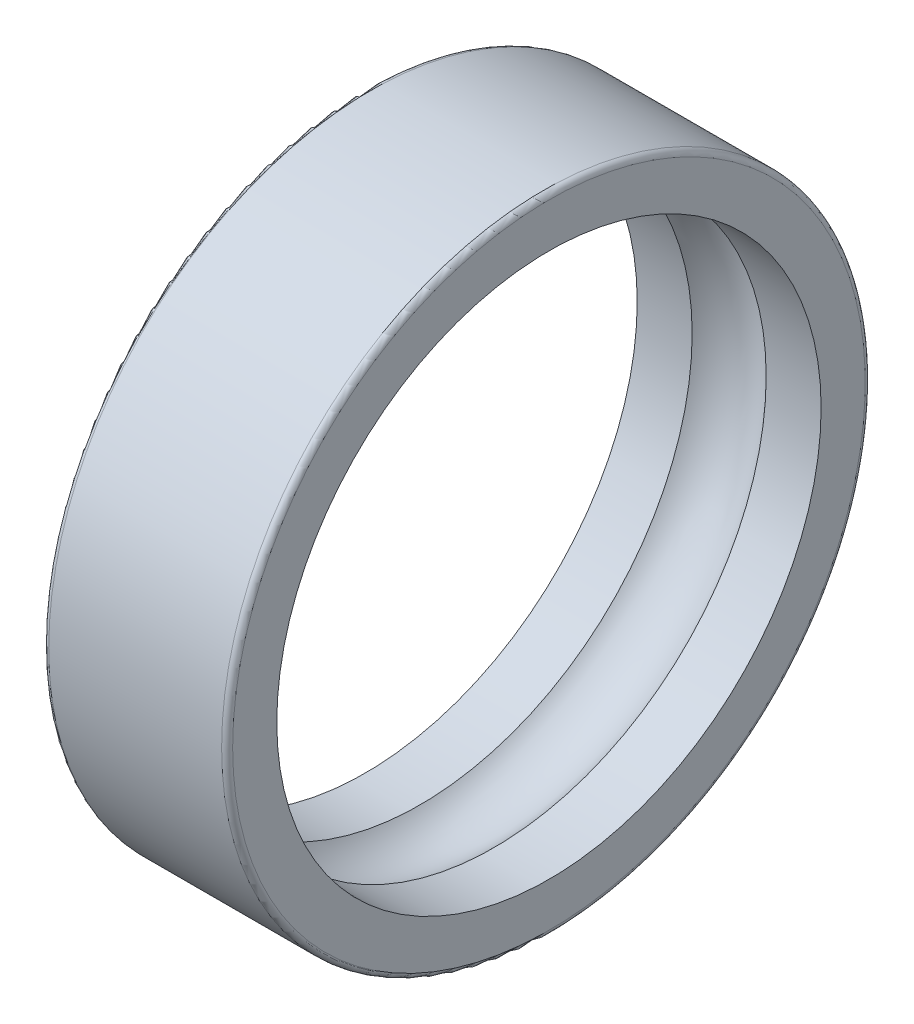
ISO-10303-21;
HEADER;
FILE_DESCRIPTION(('STEP AP214'),'2;1');
FILE_NAME('part.step','',(''),(''),'','','');
FILE_SCHEMA(('AUTOMOTIVE_DESIGN { 1 0 10303 214 1 1 1 1 }'));
ENDSEC;
DATA;
#1=APPLICATION_CONTEXT('core data for automotive mechanical design processes');
#2=APPLICATION_PROTOCOL_DEFINITION('international standard','automotive_design',2000,#1);
#3=PRODUCT_CONTEXT('',#1,'mechanical');
#4=PRODUCT('Part','Part','',(#3));
#5=PRODUCT_RELATED_PRODUCT_CATEGORY('part','',(#4));
#6=PRODUCT_DEFINITION_FORMATION('','',#4);
#7=PRODUCT_DEFINITION_CONTEXT('part definition',#1,'design');
#8=PRODUCT_DEFINITION('design','',#6,#7);
#9=PRODUCT_DEFINITION_SHAPE('','',#8);
#10=(LENGTH_UNIT() NAMED_UNIT(*) SI_UNIT(.MILLI.,.METRE.));
#11=(NAMED_UNIT(*) PLANE_ANGLE_UNIT() SI_UNIT($,.RADIAN.));
#12=(NAMED_UNIT(*) SI_UNIT($,.STERADIAN.) SOLID_ANGLE_UNIT());
#13=UNCERTAINTY_MEASURE_WITH_UNIT(LENGTH_MEASURE(1.E-05),#10,'distance_accuracy_value','');
#14=(GEOMETRIC_REPRESENTATION_CONTEXT(3) GLOBAL_UNCERTAINTY_ASSIGNED_CONTEXT((#13)) GLOBAL_UNIT_ASSIGNED_CONTEXT((#10,
#11,#12)) REPRESENTATION_CONTEXT('',''));
#15=CARTESIAN_POINT('',(0.,0.,0.));
#16=DIRECTION('',(0.,0.,1.));
#17=DIRECTION('',(1.,0.,0.));
#18=AXIS2_PLACEMENT_3D('',#15,#16,#17);
#19=CARTESIAN_POINT('',(0.3,0.,0.));
#20=DIRECTION('',(-1.,0.,0.));
#21=DIRECTION('',(0.,0.,1.));
#22=AXIS2_PLACEMENT_3D('',#19,#20,#21);
#23=TOROIDAL_SURFACE('',#22,17.2,0.300000000000002);
#24=CARTESIAN_POINT('',(0.,0.,0.));
#25=DIRECTION('',(-1.,0.,0.));
#26=DIRECTION('',(0.,0.,1.));
#27=AXIS2_PLACEMENT_3D('',#24,#25,#26);
#28=CIRCLE('',#27,17.2);
#29=CARTESIAN_POINT('',(0.,0.,17.2));
#30=VERTEX_POINT('',#29);
#31=EDGE_CURVE('E10',#30,#30,#28,.T.);
#32=ORIENTED_EDGE('',*,*,#31,.F.);
#33=EDGE_LOOP('',(#32));
#34=FACE_BOUND('',#33,.T.);
#35=CARTESIAN_POINT('',(0.3,0.,0.));
#36=DIRECTION('',(-1.,0.,0.));
#37=DIRECTION('',(0.,0.,1.));
#38=AXIS2_PLACEMENT_3D('',#35,#36,#37);
#39=CIRCLE('',#38,17.5);
#40=CARTESIAN_POINT('',(0.3,0.,17.5));
#41=VERTEX_POINT('',#40);
#42=EDGE_CURVE('E57',#41,#41,#39,.T.);
#43=ORIENTED_EDGE('',*,*,#42,.T.);
#44=EDGE_LOOP('',(#43));
#45=FACE_BOUND('',#44,.T.);
#46=ADVANCED_FACE('F29',(#34,#45),#23,.T.);
#47=CARTESIAN_POINT('',(0.,0.,-17.2));
#48=DIRECTION('',(1.,0.,0.));
#49=DIRECTION('',(0.,0.,-1.));
#50=AXIS2_PLACEMENT_3D('',#47,#48,#49);
#51=PLANE('',#50);
#52=CARTESIAN_POINT('',(0.,0.,0.));
#53=DIRECTION('',(-1.,0.,0.));
#54=DIRECTION('',(0.,0.,1.));
#55=AXIS2_PLACEMENT_3D('',#52,#53,#54);
#56=CIRCLE('',#55,14.8);
#57=CARTESIAN_POINT('',(0.,0.,14.8));
#58=VERTEX_POINT('',#57);
#59=EDGE_CURVE('E35',#58,#58,#56,.T.);
#60=ORIENTED_EDGE('',*,*,#59,.F.);
#61=EDGE_LOOP('',(#60));
#62=FACE_BOUND('',#61,.T.);
#63=ORIENTED_EDGE('',*,*,#31,.T.);
#64=EDGE_LOOP('',(#63));
#65=FACE_BOUND('',#64,.T.);
#66=ADVANCED_FACE('F94',(#62,#65),#51,.F.);
#67=CARTESIAN_POINT('',(0.,0.,0.));
#68=DIRECTION('',(-1.,0.,0.));
#69=DIRECTION('',(0.,0.,1.));
#70=AXIS2_PLACEMENT_3D('',#67,#68,#69);
#71=CYLINDRICAL_SURFACE('',#70,14.8);
#72=CARTESIAN_POINT('',(2.98753882025019,0.,0.));
#73=DIRECTION('',(-1.,0.,0.));
#74=DIRECTION('',(0.,0.,1.));
#75=AXIS2_PLACEMENT_3D('',#72,#73,#74);
#76=CIRCLE('',#75,14.8);
#77=CARTESIAN_POINT('',(2.98753882025019,0.,14.8));
#78=VERTEX_POINT('',#77);
#79=EDGE_CURVE('E39',#78,#78,#76,.T.);
#80=ORIENTED_EDGE('',*,*,#79,.F.);
#81=EDGE_LOOP('',(#80));
#82=FACE_BOUND('',#81,.T.);
#83=ORIENTED_EDGE('',*,*,#59,.T.);
#84=EDGE_LOOP('',(#83));
#85=FACE_BOUND('',#84,.T.);
#86=ADVANCED_FACE('F89',(#82,#85),#71,.F.);
#87=CARTESIAN_POINT('',(5.,0.,0.));
#88=DIRECTION('',(-1.,0.,0.));
#89=DIRECTION('',(0.,0.,1.));
#90=AXIS2_PLACEMENT_3D('',#87,#88,#89);
#91=TOROIDAL_SURFACE('',#90,13.,2.7);
#92=CARTESIAN_POINT('',(7.01246117974981,0.,0.));
#93=DIRECTION('',(-1.,0.,0.));
#94=DIRECTION('',(0.,0.,1.));
#95=AXIS2_PLACEMENT_3D('',#92,#93,#94);
#96=CIRCLE('',#95,14.8);
#97=CARTESIAN_POINT('',(7.01246117974981,0.,14.8));
#98=VERTEX_POINT('',#97);
#99=EDGE_CURVE('E43',#98,#98,#96,.T.);
#100=ORIENTED_EDGE('',*,*,#99,.F.);
#101=EDGE_LOOP('',(#100));
#102=FACE_BOUND('',#101,.T.);
#103=ORIENTED_EDGE('',*,*,#79,.T.);
#104=EDGE_LOOP('',(#103));
#105=FACE_BOUND('',#104,.T.);
#106=ADVANCED_FACE('F83',(#102,#105),#91,.F.);
#107=CARTESIAN_POINT('',(0.,0.,0.));
#108=DIRECTION('',(-1.,0.,0.));
#109=DIRECTION('',(0.,0.,1.));
#110=AXIS2_PLACEMENT_3D('',#107,#108,#109);
#111=CYLINDRICAL_SURFACE('',#110,14.8);
#112=CARTESIAN_POINT('',(10.,0.,0.));
#113=DIRECTION('',(-1.,0.,0.));
#114=DIRECTION('',(0.,0.,1.));
#115=AXIS2_PLACEMENT_3D('',#112,#113,#114);
#116=CIRCLE('',#115,14.8);
#117=CARTESIAN_POINT('',(10.,0.,14.8));
#118=VERTEX_POINT('',#117);
#119=EDGE_CURVE('E48',#118,#118,#116,.T.);
#120=ORIENTED_EDGE('',*,*,#119,.F.);
#121=EDGE_LOOP('',(#120));
#122=FACE_BOUND('',#121,.T.);
#123=ORIENTED_EDGE('',*,*,#99,.T.);
#124=EDGE_LOOP('',(#123));
#125=FACE_BOUND('',#124,.T.);
#126=ADVANCED_FACE('F77',(#122,#125),#111,.F.);
#127=CARTESIAN_POINT('',(10.,0.,-17.2));
#128=DIRECTION('',(-1.,0.,0.));
#129=DIRECTION('',(0.,0.,1.));
#130=AXIS2_PLACEMENT_3D('',#127,#128,#129);
#131=PLANE('',#130);
#132=CARTESIAN_POINT('',(10.,0.,0.));
#133=DIRECTION('',(-1.,0.,0.));
#134=DIRECTION('',(0.,0.,1.));
#135=AXIS2_PLACEMENT_3D('',#132,#133,#134);
#136=CIRCLE('',#135,17.2);
#137=CARTESIAN_POINT('',(10.,0.,17.2));
#138=VERTEX_POINT('',#137);
#139=EDGE_CURVE('E51',#138,#138,#136,.T.);
#140=ORIENTED_EDGE('',*,*,#139,.F.);
#141=EDGE_LOOP('',(#140));
#142=FACE_BOUND('',#141,.T.);
#143=ORIENTED_EDGE('',*,*,#119,.T.);
#144=EDGE_LOOP('',(#143));
#145=FACE_BOUND('',#144,.T.);
#146=ADVANCED_FACE('F71',(#142,#145),#131,.F.);
#147=CARTESIAN_POINT('',(9.7,0.,0.));
#148=DIRECTION('',(-1.,0.,0.));
#149=DIRECTION('',(0.,0.,1.));
#150=AXIS2_PLACEMENT_3D('',#147,#148,#149);
#151=TOROIDAL_SURFACE('',#150,17.2,0.300000000000002);
#152=CARTESIAN_POINT('',(9.7,0.,0.));
#153=DIRECTION('',(-1.,0.,0.));
#154=DIRECTION('',(0.,0.,1.));
#155=AXIS2_PLACEMENT_3D('',#152,#153,#154);
#156=CIRCLE('',#155,17.5);
#157=CARTESIAN_POINT('',(9.7,0.,17.5));
#158=VERTEX_POINT('',#157);
#159=EDGE_CURVE('E54',#158,#158,#156,.T.);
#160=ORIENTED_EDGE('',*,*,#159,.F.);
#161=EDGE_LOOP('',(#160));
#162=FACE_BOUND('',#161,.T.);
#163=ORIENTED_EDGE('',*,*,#139,.T.);
#164=EDGE_LOOP('',(#163));
#165=FACE_BOUND('',#164,.T.);
#166=ADVANCED_FACE('F65',(#162,#165),#151,.T.);
#167=CARTESIAN_POINT('',(0.,0.,0.));
#168=DIRECTION('',(-1.,0.,0.));
#169=DIRECTION('',(0.,0.,1.));
#170=AXIS2_PLACEMENT_3D('',#167,#168,#169);
#171=CYLINDRICAL_SURFACE('',#170,17.5);
#172=ORIENTED_EDGE('',*,*,#42,.F.);
#173=EDGE_LOOP('',(#172));
#174=FACE_BOUND('',#173,.T.);
#175=ORIENTED_EDGE('',*,*,#159,.T.);
#176=EDGE_LOOP('',(#175));
#177=FACE_BOUND('',#176,.T.);
#178=ADVANCED_FACE('F62',(#174,#177),#171,.T.);
#179=CLOSED_SHELL('',(#46,#66,#86,#106,#126,#146,#166,#178));
#180=MANIFOLD_SOLID_BREP('B2',#179);
#181=ADVANCED_BREP_SHAPE_REPRESENTATION('',(#18,#180),#14);
#182=SHAPE_DEFINITION_REPRESENTATION(#9,#181);
ENDSEC;
END-ISO-10303-21;
